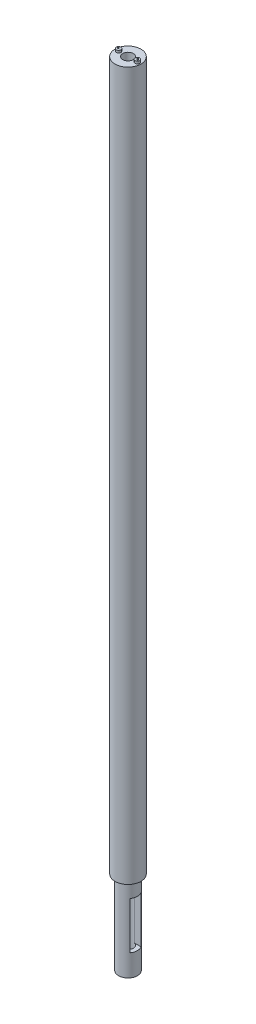
ISO-10303-21;
HEADER;
FILE_DESCRIPTION(('STEP AP214'),'2;1');
FILE_NAME('part.step','',(''),(''),'','','');
FILE_SCHEMA(('AUTOMOTIVE_DESIGN { 1 0 10303 214 1 1 1 1 }'));
ENDSEC;
DATA;
#1=APPLICATION_CONTEXT('core data for automotive mechanical design processes');
#2=APPLICATION_PROTOCOL_DEFINITION('international standard','automotive_design',2000,#1);
#3=PRODUCT_CONTEXT('',#1,'mechanical');
#4=PRODUCT('Part','Part','',(#3));
#5=PRODUCT_RELATED_PRODUCT_CATEGORY('part','',(#4));
#6=PRODUCT_DEFINITION_FORMATION('','',#4);
#7=PRODUCT_DEFINITION_CONTEXT('part definition',#1,'design');
#8=PRODUCT_DEFINITION('design','',#6,#7);
#9=PRODUCT_DEFINITION_SHAPE('','',#8);
#10=(LENGTH_UNIT() NAMED_UNIT(*) SI_UNIT(.MILLI.,.METRE.));
#11=(NAMED_UNIT(*) PLANE_ANGLE_UNIT() SI_UNIT($,.RADIAN.));
#12=(NAMED_UNIT(*) SI_UNIT($,.STERADIAN.) SOLID_ANGLE_UNIT());
#13=UNCERTAINTY_MEASURE_WITH_UNIT(LENGTH_MEASURE(1.E-05),#10,'distance_accuracy_value','');
#14=(GEOMETRIC_REPRESENTATION_CONTEXT(3) GLOBAL_UNCERTAINTY_ASSIGNED_CONTEXT((#13)) GLOBAL_UNIT_ASSIGNED_CONTEXT((#10,
#11,#12)) REPRESENTATION_CONTEXT('',''));
#15=CARTESIAN_POINT('',(0.,0.,0.));
#16=DIRECTION('',(0.,0.,1.));
#17=DIRECTION('',(1.,0.,0.));
#18=AXIS2_PLACEMENT_3D('',#15,#16,#17);
#19=CARTESIAN_POINT('',(0.,0.,0.));
#20=DIRECTION('',(0.,1.,0.));
#21=DIRECTION('',(0.,0.,1.));
#22=AXIS2_PLACEMENT_3D('',#19,#20,#21);
#23=CYLINDRICAL_SURFACE('',#22,4.);
#24=CARTESIAN_POINT('',(0.,35.4701654306902,0.));
#25=DIRECTION('',(0.,1.,0.));
#26=DIRECTION('',(0.,0.,1.));
#27=AXIS2_PLACEMENT_3D('',#24,#25,#26);
#28=CIRCLE('',#27,4.);
#29=CARTESIAN_POINT('',(0.,35.4701654306902,4.));
#30=VERTEX_POINT('',#29);
#31=EDGE_CURVE('E174',#30,#30,#28,.T.);
#32=ORIENTED_EDGE('',*,*,#31,.F.);
#33=EDGE_LOOP('',(#32));
#34=FACE_BOUND('',#33,.T.);
#35=CARTESIAN_POINT('',(0.,0.,0.));
#36=DIRECTION('',(0.,1.,0.));
#37=DIRECTION('',(0.,0.,1.));
#38=AXIS2_PLACEMENT_3D('',#35,#36,#37);
#39=CIRCLE('',#38,4.);
#40=CARTESIAN_POINT('',(0.,0.,4.));
#41=VERTEX_POINT('',#40);
#42=EDGE_CURVE('E171',#41,#41,#39,.T.);
#43=ORIENTED_EDGE('',*,*,#42,.T.);
#44=EDGE_LOOP('',(#43));
#45=FACE_BOUND('',#44,.T.);
#46=CARTESIAN_POINT('',(0.,29.2361240663793,0.));
#47=DIRECTION('',(0.,-1.,0.));
#48=DIRECTION('',(0.,0.,-1.));
#49=AXIS2_PLACEMENT_3D('',#46,#47,#48);
#50=CIRCLE('',#49,4.);
#51=CARTESIAN_POINT('',(3.25988866432964,29.2361240663793,2.31800040901099));
#52=VERTEX_POINT('',#51);
#53=CARTESIAN_POINT('',(3.35244355432329,29.2361240663793,-2.18199959098901));
#54=VERTEX_POINT('',#53);
#55=EDGE_CURVE('E123',#52,#54,#50,.F.);
#56=ORIENTED_EDGE('',*,*,#55,.T.);
#57=DIRECTION('',(0.,1.,0.));
#58=VECTOR('',#57,1.);
#59=CARTESIAN_POINT('',(3.35244355432329,0.,-2.18199959098901));
#60=LINE('',#59,#58);
#61=CARTESIAN_POINT('',(3.35244355432329,9.23612406637925,-2.18199959098901));
#62=VERTEX_POINT('',#61);
#63=EDGE_CURVE('E150',#54,#62,#60,.F.);
#64=ORIENTED_EDGE('',*,*,#63,.T.);
#65=CARTESIAN_POINT('',(0.,9.23612406637925,0.));
#66=DIRECTION('',(0.,1.,0.));
#67=DIRECTION('',(0.,0.,1.));
#68=AXIS2_PLACEMENT_3D('',#65,#66,#67);
#69=CIRCLE('',#68,4.);
#70=CARTESIAN_POINT('',(3.25988866432964,9.23612406637925,2.31800040901099));
#71=VERTEX_POINT('',#70);
#72=EDGE_CURVE('E146',#62,#71,#69,.F.);
#73=ORIENTED_EDGE('',*,*,#72,.T.);
#74=DIRECTION('',(0.,1.,0.));
#75=VECTOR('',#74,1.);
#76=CARTESIAN_POINT('',(3.25988866432964,0.,2.31800040901099));
#77=LINE('',#76,#75);
#78=EDGE_CURVE('E186',#71,#52,#77,.T.);
#79=ORIENTED_EDGE('',*,*,#78,.T.);
#80=EDGE_LOOP('',(#56,#64,#73,#79));
#81=FACE_BOUND('',#80,.T.);
#82=ADVANCED_FACE('F69',(#34,#45,#81),#23,.T.);
#83=CARTESIAN_POINT('',(0.,336.287525335179,0.));
#84=DIRECTION('',(0.,-1.,0.));
#85=DIRECTION('',(0.,0.,-1.));
#86=AXIS2_PLACEMENT_3D('',#83,#84,#85);
#87=CYLINDRICAL_SURFACE('',#86,2.25);
#88=CARTESIAN_POINT('',(0.,336.287525335179,0.));
#89=DIRECTION('',(0.,1.,0.));
#90=DIRECTION('',(0.,0.,1.));
#91=AXIS2_PLACEMENT_3D('',#88,#89,#90);
#92=CIRCLE('',#91,2.25);
#93=CARTESIAN_POINT('',(0.,336.287525335179,2.25));
#94=VERTEX_POINT('',#93);
#95=EDGE_CURVE('E160',#94,#94,#92,.T.);
#96=ORIENTED_EDGE('',*,*,#95,.T.);
#97=EDGE_LOOP('',(#96));
#98=FACE_BOUND('',#97,.T.);
#99=CARTESIAN_POINT('',(0.,0.,0.));
#100=DIRECTION('',(0.,1.,0.));
#101=DIRECTION('',(0.,0.,1.));
#102=AXIS2_PLACEMENT_3D('',#99,#100,#101);
#103=CIRCLE('',#102,2.25);
#104=CARTESIAN_POINT('',(0.,0.,2.25));
#105=VERTEX_POINT('',#104);
#106=EDGE_CURVE('E159',#105,#105,#103,.T.);
#107=ORIENTED_EDGE('',*,*,#106,.F.);
#108=EDGE_LOOP('',(#107));
#109=FACE_BOUND('',#108,.T.);
#110=CARTESIAN_POINT('',(0.,9.23612406637925,0.));
#111=DIRECTION('',(0.,1.,0.));
#112=DIRECTION('',(0.,0.,1.));
#113=AXIS2_PLACEMENT_3D('',#110,#111,#112);
#114=CIRCLE('',#113,2.25);
#115=CARTESIAN_POINT('',(0.,9.23612406637925,2.25));
#116=VERTEX_POINT('',#115);
#117=CARTESIAN_POINT('',(0.548978856536192,9.23612406637925,-2.18199959098901));
#118=VERTEX_POINT('',#117);
#119=EDGE_CURVE('E178',#116,#118,#114,.T.);
#120=ORIENTED_EDGE('',*,*,#119,.T.);
#121=DIRECTION('',(0.,-1.,0.));
#122=VECTOR('',#121,1.);
#123=CARTESIAN_POINT('',(0.548978856536304,336.287525335179,-2.18199959098898));
#124=LINE('',#123,#122);
#125=CARTESIAN_POINT('',(0.548978856536199,29.2361240663793,-2.18199959098901));
#126=VERTEX_POINT('',#125);
#127=EDGE_CURVE('E183',#118,#126,#124,.F.);
#128=ORIENTED_EDGE('',*,*,#127,.T.);
#129=CARTESIAN_POINT('',(0.,29.2361240663793,0.));
#130=DIRECTION('',(0.,-1.,0.));
#131=DIRECTION('',(0.,0.,-1.));
#132=AXIS2_PLACEMENT_3D('',#129,#130,#131);
#133=CIRCLE('',#132,2.25);
#134=CARTESIAN_POINT('',(0.,29.2361240663793,2.25));
#135=VERTEX_POINT('',#134);
#136=EDGE_CURVE('E181',#126,#135,#133,.T.);
#137=ORIENTED_EDGE('',*,*,#136,.T.);
#138=DIRECTION('',(0.,-1.,0.));
#139=VECTOR('',#138,1.);
#140=CARTESIAN_POINT('',(0.,336.287525335179,2.25));
#141=LINE('',#140,#139);
#142=EDGE_CURVE('E132',#135,#116,#141,.T.);
#143=ORIENTED_EDGE('',*,*,#142,.T.);
#144=EDGE_LOOP('',(#120,#128,#137,#143));
#145=FACE_BOUND('',#144,.T.);
#146=ADVANCED_FACE('F211',(#98,#109,#145),#87,.F.);
#147=CARTESIAN_POINT('',(0.,0.,0.));
#148=DIRECTION('',(0.,1.,0.));
#149=DIRECTION('',(0.,0.,1.));
#150=AXIS2_PLACEMENT_3D('',#147,#148,#149);
#151=PLANE('',#150);
#152=ORIENTED_EDGE('',*,*,#106,.T.);
#153=EDGE_LOOP('',(#152));
#154=FACE_BOUND('',#153,.T.);
#155=ORIENTED_EDGE('',*,*,#42,.F.);
#156=EDGE_LOOP('',(#155));
#157=FACE_BOUND('',#156,.T.);
#158=ADVANCED_FACE('F71',(#154,#157),#151,.F.);
#159=CARTESIAN_POINT('',(0.,35.4701654306902,0.));
#160=DIRECTION('',(0.,1.,0.));
#161=DIRECTION('',(0.,0.,1.));
#162=AXIS2_PLACEMENT_3D('',#159,#160,#161);
#163=PLANE('',#162);
#164=ORIENTED_EDGE('',*,*,#31,.T.);
#165=EDGE_LOOP('',(#164));
#166=FACE_BOUND('',#165,.T.);
#167=CARTESIAN_POINT('',(0.,35.4701654306902,0.));
#168=DIRECTION('',(0.,1.,0.));
#169=DIRECTION('',(0.,0.,1.));
#170=AXIS2_PLACEMENT_3D('',#167,#168,#169);
#171=CIRCLE('',#170,5.5);
#172=CARTESIAN_POINT('',(0.,35.4701654306902,5.5));
#173=VERTEX_POINT('',#172);
#174=EDGE_CURVE('E163',#173,#173,#171,.T.);
#175=ORIENTED_EDGE('',*,*,#174,.F.);
#176=EDGE_LOOP('',(#175));
#177=FACE_BOUND('',#176,.T.);
#178=ADVANCED_FACE('F221',(#166,#177),#163,.F.);
#179=CARTESIAN_POINT('',(0.,336.287525335179,0.));
#180=DIRECTION('',(0.,1.,0.));
#181=DIRECTION('',(0.,0.,1.));
#182=AXIS2_PLACEMENT_3D('',#179,#180,#181);
#183=PLANE('',#182);
#184=CARTESIAN_POINT('',(3.9999999999964,336.287525335179,5.3630320457482E-06));
#185=DIRECTION('',(0.,1.,0.));
#186=DIRECTION('',(0.,0.,1.));
#187=AXIS2_PLACEMENT_3D('',#184,#185,#186);
#188=CIRCLE('',#187,1.);
#189=CARTESIAN_POINT('',(3.9999999999964,336.287525335179,1.00000536303205));
#190=VERTEX_POINT('',#189);
#191=EDGE_CURVE('E253',#190,#190,#188,.T.);
#192=ORIENTED_EDGE('',*,*,#191,.F.);
#193=EDGE_LOOP('',(#192));
#194=FACE_BOUND('',#193,.T.);
#195=CARTESIAN_POINT('',(-3.9999999999999,336.287525335179,9.02730647219752E-07));
#196=DIRECTION('',(0.,1.,0.));
#197=DIRECTION('',(0.,0.,1.));
#198=AXIS2_PLACEMENT_3D('',#195,#196,#197);
#199=CIRCLE('',#198,1.);
#200=CARTESIAN_POINT('',(-3.9999999999999,336.287525335179,1.00000090273065));
#201=VERTEX_POINT('',#200);
#202=EDGE_CURVE('E256',#201,#201,#199,.T.);
#203=ORIENTED_EDGE('',*,*,#202,.F.);
#204=EDGE_LOOP('',(#203));
#205=FACE_BOUND('',#204,.T.);
#206=ORIENTED_EDGE('',*,*,#95,.F.);
#207=EDGE_LOOP('',(#206));
#208=FACE_BOUND('',#207,.T.);
#209=CARTESIAN_POINT('',(0.,336.287525335179,0.));
#210=DIRECTION('',(0.,1.,0.));
#211=DIRECTION('',(0.,0.,1.));
#212=AXIS2_PLACEMENT_3D('',#209,#210,#211);
#213=CIRCLE('',#212,5.5);
#214=CARTESIAN_POINT('',(0.,336.287525335179,5.5));
#215=VERTEX_POINT('',#214);
#216=EDGE_CURVE('E168',#215,#215,#213,.T.);
#217=ORIENTED_EDGE('',*,*,#216,.T.);
#218=EDGE_LOOP('',(#217));
#219=FACE_BOUND('',#218,.T.);
#220=ADVANCED_FACE('F224',(#194,#205,#208,#219),#183,.T.);
#221=CARTESIAN_POINT('',(0.,35.4701654306902,0.));
#222=DIRECTION('',(0.,1.,0.));
#223=DIRECTION('',(0.,0.,1.));
#224=AXIS2_PLACEMENT_3D('',#221,#222,#223);
#225=CYLINDRICAL_SURFACE('',#224,5.5);
#226=ORIENTED_EDGE('',*,*,#216,.F.);
#227=EDGE_LOOP('',(#226));
#228=FACE_BOUND('',#227,.T.);
#229=ORIENTED_EDGE('',*,*,#174,.T.);
#230=EDGE_LOOP('',(#229));
#231=FACE_BOUND('',#230,.T.);
#232=ADVANCED_FACE('F229',(#228,#231),#225,.T.);
#233=CARTESIAN_POINT('',(20.,29.2361240663793,-2.18199959098901));
#234=DIRECTION('',(0.,0.,1.));
#235=DIRECTION('',(0.,-1.,0.));
#236=AXIS2_PLACEMENT_3D('',#233,#234,#235);
#237=PLANE('',#236);
#238=DIRECTION('',(-1.,0.,0.));
#239=VECTOR('',#238,1.);
#240=CARTESIAN_POINT('',(20.,29.2361240663793,-2.18199959098901));
#241=LINE('',#240,#239);
#242=EDGE_CURVE('E127',#54,#126,#241,.T.);
#243=ORIENTED_EDGE('',*,*,#242,.T.);
#244=ORIENTED_EDGE('',*,*,#127,.F.);
#245=DIRECTION('',(-1.,0.,0.));
#246=VECTOR('',#245,1.);
#247=CARTESIAN_POINT('',(20.,9.23612406637925,-2.18199959098901));
#248=LINE('',#247,#246);
#249=EDGE_CURVE('E137',#62,#118,#248,.T.);
#250=ORIENTED_EDGE('',*,*,#249,.F.);
#251=ORIENTED_EDGE('',*,*,#63,.F.);
#252=EDGE_LOOP('',(#243,#244,#250,#251));
#253=FACE_BOUND('',#252,.T.);
#254=ADVANCED_FACE('F226',(#253),#237,.T.);
#255=CARTESIAN_POINT('',(20.,29.2361240663793,2.31800040901099));
#256=DIRECTION('',(0.,-1.,0.));
#257=DIRECTION('',(0.,0.,-1.));
#258=AXIS2_PLACEMENT_3D('',#255,#256,#257);
#259=PLANE('',#258);
#260=DIRECTION('',(-1.,0.,0.));
#261=VECTOR('',#260,1.);
#262=CARTESIAN_POINT('',(20.,29.2361240663793,2.31800040901099));
#263=LINE('',#262,#261);
#264=CARTESIAN_POINT('',(0.,29.2361240663793,2.31800040901099));
#265=VERTEX_POINT('',#264);
#266=EDGE_CURVE('E116',#52,#265,#263,.T.);
#267=ORIENTED_EDGE('',*,*,#266,.T.);
#268=DIRECTION('',(0.,0.,1.));
#269=VECTOR('',#268,1.);
#270=CARTESIAN_POINT('',(0.,29.2361240663793,2.31800040901099));
#271=LINE('',#270,#269);
#272=EDGE_CURVE('E119',#135,#265,#271,.T.);
#273=ORIENTED_EDGE('',*,*,#272,.F.);
#274=ORIENTED_EDGE('',*,*,#136,.F.);
#275=ORIENTED_EDGE('',*,*,#242,.F.);
#276=ORIENTED_EDGE('',*,*,#55,.F.);
#277=EDGE_LOOP('',(#267,#273,#274,#275,#276));
#278=FACE_BOUND('',#277,.T.);
#279=ADVANCED_FACE('F118',(#278),#259,.T.);
#280=CARTESIAN_POINT('',(20.,9.23612406637925,2.31800040901099));
#281=DIRECTION('',(0.,0.,-1.));
#282=DIRECTION('',(-1.,0.,0.));
#283=AXIS2_PLACEMENT_3D('',#280,#281,#282);
#284=PLANE('',#283);
#285=DIRECTION('',(-1.,0.,0.));
#286=VECTOR('',#285,1.);
#287=CARTESIAN_POINT('',(20.,9.23612406637925,2.31800040901099));
#288=LINE('',#287,#286);
#289=CARTESIAN_POINT('',(0.,9.23612406637925,2.31800040901099));
#290=VERTEX_POINT('',#289);
#291=EDGE_CURVE('E84',#71,#290,#288,.T.);
#292=ORIENTED_EDGE('',*,*,#291,.T.);
#293=DIRECTION('',(0.,-1.,0.));
#294=VECTOR('',#293,1.);
#295=CARTESIAN_POINT('',(0.,9.23612406637925,2.31800040901099));
#296=LINE('',#295,#294);
#297=EDGE_CURVE('E130',#265,#290,#296,.T.);
#298=ORIENTED_EDGE('',*,*,#297,.F.);
#299=ORIENTED_EDGE('',*,*,#266,.F.);
#300=ORIENTED_EDGE('',*,*,#78,.F.);
#301=EDGE_LOOP('',(#292,#298,#299,#300));
#302=FACE_BOUND('',#301,.T.);
#303=ADVANCED_FACE('F135',(#302),#284,.T.);
#304=CARTESIAN_POINT('',(20.,9.23612406637925,2.31800040901099));
#305=DIRECTION('',(0.,1.,0.));
#306=DIRECTION('',(0.,0.,1.));
#307=AXIS2_PLACEMENT_3D('',#304,#305,#306);
#308=PLANE('',#307);
#309=ORIENTED_EDGE('',*,*,#249,.T.);
#310=ORIENTED_EDGE('',*,*,#119,.F.);
#311=DIRECTION('',(0.,0.,-1.));
#312=VECTOR('',#311,1.);
#313=CARTESIAN_POINT('',(0.,9.23612406637925,2.31800040901099));
#314=LINE('',#313,#312);
#315=EDGE_CURVE('E91',#290,#116,#314,.T.);
#316=ORIENTED_EDGE('',*,*,#315,.F.);
#317=ORIENTED_EDGE('',*,*,#291,.F.);
#318=ORIENTED_EDGE('',*,*,#72,.F.);
#319=EDGE_LOOP('',(#309,#310,#316,#317,#318));
#320=FACE_BOUND('',#319,.T.);
#321=ADVANCED_FACE('F274',(#320),#308,.T.);
#322=CARTESIAN_POINT('',(0.,0.,0.));
#323=DIRECTION('',(1.,0.,0.));
#324=DIRECTION('',(0.,0.,-1.));
#325=AXIS2_PLACEMENT_3D('',#322,#323,#324);
#326=PLANE('',#325);
#327=ORIENTED_EDGE('',*,*,#272,.T.);
#328=ORIENTED_EDGE('',*,*,#297,.T.);
#329=ORIENTED_EDGE('',*,*,#315,.T.);
#330=ORIENTED_EDGE('',*,*,#142,.F.);
#331=EDGE_LOOP('',(#327,#328,#329,#330));
#332=FACE_BOUND('',#331,.T.);
#333=ADVANCED_FACE('F129',(#332),#326,.T.);
#334=CARTESIAN_POINT('',(-3.9999999999999,337.287525335179,9.02730647219752E-07));
#335=DIRECTION('',(0.,-1.,0.));
#336=DIRECTION('',(0.,0.,-1.));
#337=AXIS2_PLACEMENT_3D('',#334,#335,#336);
#338=CYLINDRICAL_SURFACE('',#337,1.);
#339=CARTESIAN_POINT('',(-3.9999999999999,337.287525335179,9.02730647219752E-07));
#340=DIRECTION('',(0.,1.,0.));
#341=DIRECTION('',(0.,0.,1.));
#342=AXIS2_PLACEMENT_3D('',#339,#340,#341);
#343=CIRCLE('',#342,1.);
#344=CARTESIAN_POINT('',(-3.9999999999999,337.287525335179,1.00000090273065));
#345=VERTEX_POINT('',#344);
#346=EDGE_CURVE('E133',#345,#345,#343,.T.);
#347=ORIENTED_EDGE('',*,*,#346,.F.);
#348=EDGE_LOOP('',(#347));
#349=FACE_BOUND('',#348,.T.);
#350=ORIENTED_EDGE('',*,*,#202,.T.);
#351=EDGE_LOOP('',(#350));
#352=FACE_BOUND('',#351,.T.);
#353=ADVANCED_FACE('F208',(#349,#352),#338,.T.);
#354=CARTESIAN_POINT('',(-3.9999999999999,337.287525335179,9.02730647219752E-07));
#355=DIRECTION('',(0.,1.,0.));
#356=DIRECTION('',(0.,0.,1.));
#357=AXIS2_PLACEMENT_3D('',#354,#355,#356);
#358=PLANE('',#357);
#359=CARTESIAN_POINT('',(-4.12500000000019,337.287525335179,9.30940979945437E-07));
#360=DIRECTION('',(0.,1.,0.));
#361=DIRECTION('',(0.,0.,1.));
#362=AXIS2_PLACEMENT_3D('',#359,#360,#361);
#363=CIRCLE('',#362,0.25);
#364=CARTESIAN_POINT('',(-4.12500000000019,337.287525335179,0.25000093094098));
#365=VERTEX_POINT('',#364);
#366=EDGE_CURVE('E77',#365,#365,#363,.F.);
#367=ORIENTED_EDGE('',*,*,#366,.T.);
#368=EDGE_LOOP('',(#367));
#369=FACE_BOUND('',#368,.T.);
#370=ORIENTED_EDGE('',*,*,#346,.T.);
#371=EDGE_LOOP('',(#370));
#372=FACE_BOUND('',#371,.T.);
#373=ADVANCED_FACE('F190',(#369,#372),#358,.T.);
#374=CARTESIAN_POINT('',(-4.12500000000019,337.787525335179,9.30940979945437E-07));
#375=DIRECTION('',(0.,1.,0.));
#376=DIRECTION('',(0.,0.,1.));
#377=AXIS2_PLACEMENT_3D('',#374,#375,#376);
#378=PLANE('',#377);
#379=CARTESIAN_POINT('',(-4.12500000000019,337.787525335179,9.30940979945437E-07));
#380=DIRECTION('',(0.,1.,0.));
#381=DIRECTION('',(0.,0.,1.));
#382=AXIS2_PLACEMENT_3D('',#379,#380,#381);
#383=CIRCLE('',#382,0.25);
#384=CARTESIAN_POINT('',(-4.12500000000019,337.787525335179,0.25000093094098));
#385=VERTEX_POINT('',#384);
#386=EDGE_CURVE('E153',#385,#385,#383,.T.);
#387=ORIENTED_EDGE('',*,*,#386,.T.);
#388=EDGE_LOOP('',(#387));
#389=FACE_BOUND('',#388,.T.);
#390=ADVANCED_FACE('F197',(#389),#378,.T.);
#391=CARTESIAN_POINT('',(-4.12500000000019,336.287525335179,9.30940979945437E-07));
#392=DIRECTION('',(0.,1.,0.));
#393=DIRECTION('',(0.,0.,1.));
#394=AXIS2_PLACEMENT_3D('',#391,#392,#393);
#395=CYLINDRICAL_SURFACE('',#394,0.25);
#396=ORIENTED_EDGE('',*,*,#366,.F.);
#397=EDGE_LOOP('',(#396));
#398=FACE_BOUND('',#397,.T.);
#399=ORIENTED_EDGE('',*,*,#386,.F.);
#400=EDGE_LOOP('',(#399));
#401=FACE_BOUND('',#400,.T.);
#402=ADVANCED_FACE('F193',(#398,#401),#395,.T.);
#403=CARTESIAN_POINT('',(3.9999999999964,337.287525335179,5.3630320457482E-06));
#404=DIRECTION('',(0.,-1.,0.));
#405=DIRECTION('',(0.,0.,-1.));
#406=AXIS2_PLACEMENT_3D('',#403,#404,#405);
#407=CYLINDRICAL_SURFACE('',#406,1.);
#408=CARTESIAN_POINT('',(3.9999999999964,337.287525335179,5.3630320457482E-06));
#409=DIRECTION('',(0.,1.,0.));
#410=DIRECTION('',(0.,0.,1.));
#411=AXIS2_PLACEMENT_3D('',#408,#409,#410);
#412=CIRCLE('',#411,1.);
#413=CARTESIAN_POINT('',(3.9999999999964,337.287525335179,1.00000536303205));
#414=VERTEX_POINT('',#413);
#415=EDGE_CURVE('E251',#414,#414,#412,.T.);
#416=ORIENTED_EDGE('',*,*,#415,.F.);
#417=EDGE_LOOP('',(#416));
#418=FACE_BOUND('',#417,.T.);
#419=ORIENTED_EDGE('',*,*,#191,.T.);
#420=EDGE_LOOP('',(#419));
#421=FACE_BOUND('',#420,.T.);
#422=ADVANCED_FACE('F196',(#418,#421),#407,.T.);
#423=CARTESIAN_POINT('',(3.9999999999964,337.287525335179,5.3630320457482E-06));
#424=DIRECTION('',(0.,1.,0.));
#425=DIRECTION('',(0.,0.,1.));
#426=AXIS2_PLACEMENT_3D('',#423,#424,#425);
#427=PLANE('',#426);
#428=CARTESIAN_POINT('',(4.12499999999629,337.287525335179,5.53062679717783E-06));
#429=DIRECTION('',(0.,1.,0.));
#430=DIRECTION('',(0.,0.,1.));
#431=AXIS2_PLACEMENT_3D('',#428,#429,#430);
#432=CIRCLE('',#431,0.25);
#433=CARTESIAN_POINT('',(4.12499999999629,337.287525335179,0.250005530626797));
#434=VERTEX_POINT('',#433);
#435=EDGE_CURVE('E12',#434,#434,#432,.F.);
#436=ORIENTED_EDGE('',*,*,#435,.T.);
#437=EDGE_LOOP('',(#436));
#438=FACE_BOUND('',#437,.T.);
#439=ORIENTED_EDGE('',*,*,#415,.T.);
#440=EDGE_LOOP('',(#439));
#441=FACE_BOUND('',#440,.T.);
#442=ADVANCED_FACE('F236',(#438,#441),#427,.T.);
#443=CARTESIAN_POINT('',(4.12499999999629,337.787525335179,5.53062679717783E-06));
#444=DIRECTION('',(0.,1.,0.));
#445=DIRECTION('',(0.,0.,1.));
#446=AXIS2_PLACEMENT_3D('',#443,#444,#445);
#447=PLANE('',#446);
#448=CARTESIAN_POINT('',(4.12499999999629,337.787525335179,5.53062679717783E-06));
#449=DIRECTION('',(0.,1.,0.));
#450=DIRECTION('',(0.,0.,1.));
#451=AXIS2_PLACEMENT_3D('',#448,#449,#450);
#452=CIRCLE('',#451,0.25);
#453=CARTESIAN_POINT('',(4.12499999999629,337.787525335179,0.250005530626797));
#454=VERTEX_POINT('',#453);
#455=EDGE_CURVE('E156',#454,#454,#452,.T.);
#456=ORIENTED_EDGE('',*,*,#455,.T.);
#457=EDGE_LOOP('',(#456));
#458=FACE_BOUND('',#457,.T.);
#459=ADVANCED_FACE('F234',(#458),#447,.T.);
#460=CARTESIAN_POINT('',(4.12499999999629,336.287525335179,5.53062679717783E-06));
#461=DIRECTION('',(0.,1.,0.));
#462=DIRECTION('',(0.,0.,1.));
#463=AXIS2_PLACEMENT_3D('',#460,#461,#462);
#464=CYLINDRICAL_SURFACE('',#463,0.25);
#465=ORIENTED_EDGE('',*,*,#435,.F.);
#466=EDGE_LOOP('',(#465));
#467=FACE_BOUND('',#466,.T.);
#468=ORIENTED_EDGE('',*,*,#455,.F.);
#469=EDGE_LOOP('',(#468));
#470=FACE_BOUND('',#469,.T.);
#471=ADVANCED_FACE('F235',(#467,#470),#464,.T.);
#472=CLOSED_SHELL('',(#82,#146,#158,#178,#220,#232,#254,#279,#303,#321,#333,#353,#373,#390,#402,
#422,#442,#459,#471));
#473=MANIFOLD_SOLID_BREP('B2',#472);
#474=ADVANCED_BREP_SHAPE_REPRESENTATION('',(#18,#473),#14);
#475=SHAPE_DEFINITION_REPRESENTATION(#9,#474);
ENDSEC;
END-ISO-10303-21;
